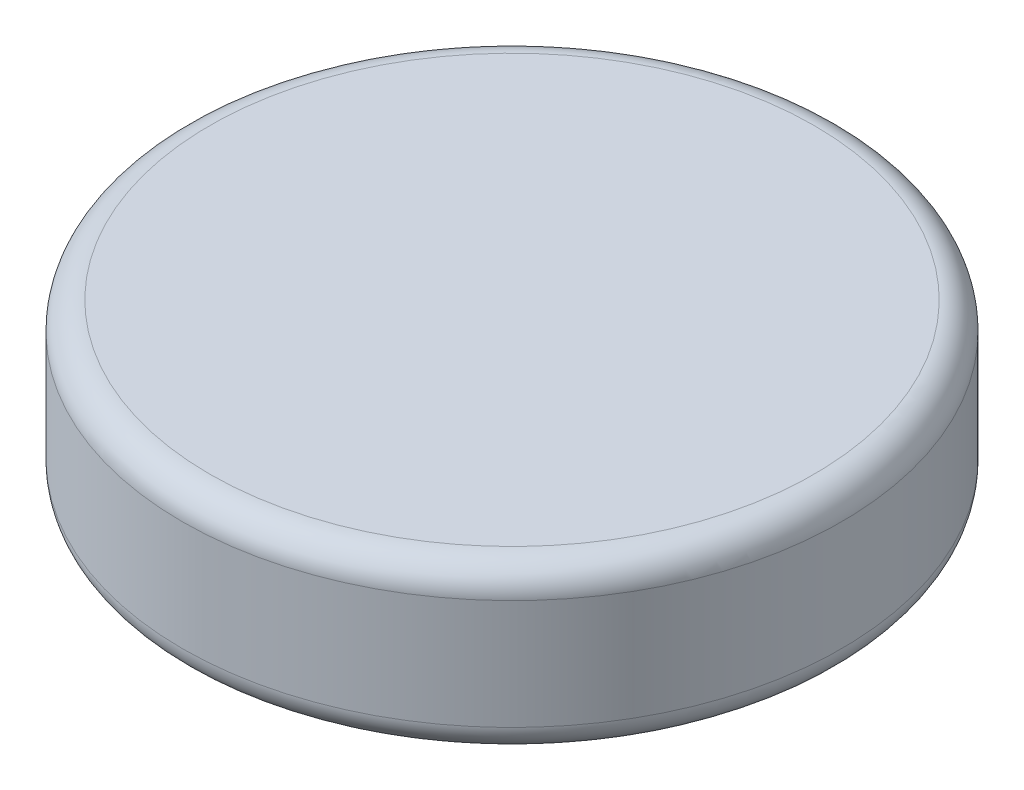
ISO-10303-21;
HEADER;
FILE_DESCRIPTION(('STEP AP214'),'2;1');
FILE_NAME('part.step','',(''),(''),'','','');
FILE_SCHEMA(('AUTOMOTIVE_DESIGN { 1 0 10303 214 1 1 1 1 }'));
ENDSEC;
DATA;
#1=APPLICATION_CONTEXT('core data for automotive mechanical design processes');
#2=APPLICATION_PROTOCOL_DEFINITION('international standard','automotive_design',2000,#1);
#3=PRODUCT_CONTEXT('',#1,'mechanical');
#4=PRODUCT('Part','Part','',(#3));
#5=PRODUCT_RELATED_PRODUCT_CATEGORY('part','',(#4));
#6=PRODUCT_DEFINITION_FORMATION('','',#4);
#7=PRODUCT_DEFINITION_CONTEXT('part definition',#1,'design');
#8=PRODUCT_DEFINITION('design','',#6,#7);
#9=PRODUCT_DEFINITION_SHAPE('','',#8);
#10=(LENGTH_UNIT() NAMED_UNIT(*) SI_UNIT(.MILLI.,.METRE.));
#11=(NAMED_UNIT(*) PLANE_ANGLE_UNIT() SI_UNIT($,.RADIAN.));
#12=(NAMED_UNIT(*) SI_UNIT($,.STERADIAN.) SOLID_ANGLE_UNIT());
#13=UNCERTAINTY_MEASURE_WITH_UNIT(LENGTH_MEASURE(1.E-05),#10,'distance_accuracy_value','');
#14=(GEOMETRIC_REPRESENTATION_CONTEXT(3) GLOBAL_UNCERTAINTY_ASSIGNED_CONTEXT((#13)) GLOBAL_UNIT_ASSIGNED_CONTEXT((#10,
#11,#12)) REPRESENTATION_CONTEXT('',''));
#15=CARTESIAN_POINT('',(0.,0.,0.));
#16=DIRECTION('',(0.,0.,1.));
#17=DIRECTION('',(1.,0.,0.));
#18=AXIS2_PLACEMENT_3D('',#15,#16,#17);
#19=CARTESIAN_POINT('',(0.,3.,0.));
#20=DIRECTION('',(0.,-1.,0.));
#21=DIRECTION('',(0.,0.,-1.));
#22=AXIS2_PLACEMENT_3D('',#19,#20,#21);
#23=CYLINDRICAL_SURFACE('',#22,5.9995);
#24=CARTESIAN_POINT('',(0.,0.5,0.));
#25=DIRECTION('',(0.,1.,0.));
#26=DIRECTION('',(0.,0.,1.));
#27=AXIS2_PLACEMENT_3D('',#24,#25,#26);
#28=CIRCLE('',#27,5.9995);
#29=CARTESIAN_POINT('',(0.,0.5,5.9995));
#30=VERTEX_POINT('',#29);
#31=EDGE_CURVE('E42',#30,#30,#28,.T.);
#32=ORIENTED_EDGE('',*,*,#31,.T.);
#33=EDGE_LOOP('',(#32));
#34=FACE_BOUND('',#33,.T.);
#35=CARTESIAN_POINT('',(0.,2.5,0.));
#36=DIRECTION('',(0.,1.,0.));
#37=DIRECTION('',(0.,0.,1.));
#38=AXIS2_PLACEMENT_3D('',#35,#36,#37);
#39=CIRCLE('',#38,5.9995);
#40=CARTESIAN_POINT('',(0.,2.5,5.9995));
#41=VERTEX_POINT('',#40);
#42=EDGE_CURVE('E46',#41,#41,#39,.F.);
#43=ORIENTED_EDGE('',*,*,#42,.T.);
#44=EDGE_LOOP('',(#43));
#45=FACE_BOUND('',#44,.T.);
#46=ADVANCED_FACE('F31',(#34,#45),#23,.T.);
#47=CARTESIAN_POINT('',(0.,3.,0.));
#48=DIRECTION('',(0.,1.,0.));
#49=DIRECTION('',(0.,0.,1.));
#50=AXIS2_PLACEMENT_3D('',#47,#48,#49);
#51=PLANE('',#50);
#52=CARTESIAN_POINT('',(0.,3.,0.));
#53=DIRECTION('',(0.,1.,0.));
#54=DIRECTION('',(0.,0.,1.));
#55=AXIS2_PLACEMENT_3D('',#52,#53,#54);
#56=CIRCLE('',#55,5.4995);
#57=CARTESIAN_POINT('',(0.,3.,5.4995));
#58=VERTEX_POINT('',#57);
#59=EDGE_CURVE('E10',#58,#58,#56,.T.);
#60=ORIENTED_EDGE('',*,*,#59,.T.);
#61=EDGE_LOOP('',(#60));
#62=FACE_BOUND('',#61,.T.);
#63=ADVANCED_FACE('F62',(#62),#51,.T.);
#64=CARTESIAN_POINT('',(0.,0.,0.));
#65=DIRECTION('',(0.,1.,0.));
#66=DIRECTION('',(0.,0.,1.));
#67=AXIS2_PLACEMENT_3D('',#64,#65,#66);
#68=PLANE('',#67);
#69=CARTESIAN_POINT('',(0.,0.,0.));
#70=DIRECTION('',(0.,1.,0.));
#71=DIRECTION('',(0.,0.,1.));
#72=AXIS2_PLACEMENT_3D('',#69,#70,#71);
#73=CIRCLE('',#72,5.4995);
#74=CARTESIAN_POINT('',(0.,0.,5.4995));
#75=VERTEX_POINT('',#74);
#76=EDGE_CURVE('E38',#75,#75,#73,.F.);
#77=ORIENTED_EDGE('',*,*,#76,.T.);
#78=EDGE_LOOP('',(#77));
#79=FACE_BOUND('',#78,.T.);
#80=ADVANCED_FACE('F59',(#79),#68,.F.);
#81=CARTESIAN_POINT('',(0.,0.5,0.));
#82=DIRECTION('',(0.,1.,0.));
#83=DIRECTION('',(0.,0.,1.));
#84=AXIS2_PLACEMENT_3D('',#81,#82,#83);
#85=TOROIDAL_SURFACE('',#84,5.4995,0.5);
#86=ORIENTED_EDGE('',*,*,#76,.F.);
#87=EDGE_LOOP('',(#86));
#88=FACE_BOUND('',#87,.T.);
#89=ORIENTED_EDGE('',*,*,#31,.F.);
#90=EDGE_LOOP('',(#89));
#91=FACE_BOUND('',#90,.T.);
#92=ADVANCED_FACE('F55',(#88,#91),#85,.T.);
#93=CARTESIAN_POINT('',(0.,2.5,0.));
#94=DIRECTION('',(0.,1.,0.));
#95=DIRECTION('',(0.,0.,1.));
#96=AXIS2_PLACEMENT_3D('',#93,#94,#95);
#97=TOROIDAL_SURFACE('',#96,5.4995,0.5);
#98=ORIENTED_EDGE('',*,*,#42,.F.);
#99=EDGE_LOOP('',(#98));
#100=FACE_BOUND('',#99,.T.);
#101=ORIENTED_EDGE('',*,*,#59,.F.);
#102=EDGE_LOOP('',(#101));
#103=FACE_BOUND('',#102,.T.);
#104=ADVANCED_FACE('F33',(#100,#103),#97,.T.);
#105=CLOSED_SHELL('',(#46,#63,#80,#92,#104));
#106=MANIFOLD_SOLID_BREP('B2',#105);
#107=ADVANCED_BREP_SHAPE_REPRESENTATION('',(#18,#106),#14);
#108=SHAPE_DEFINITION_REPRESENTATION(#9,#107);
ENDSEC;
END-ISO-10303-21;
